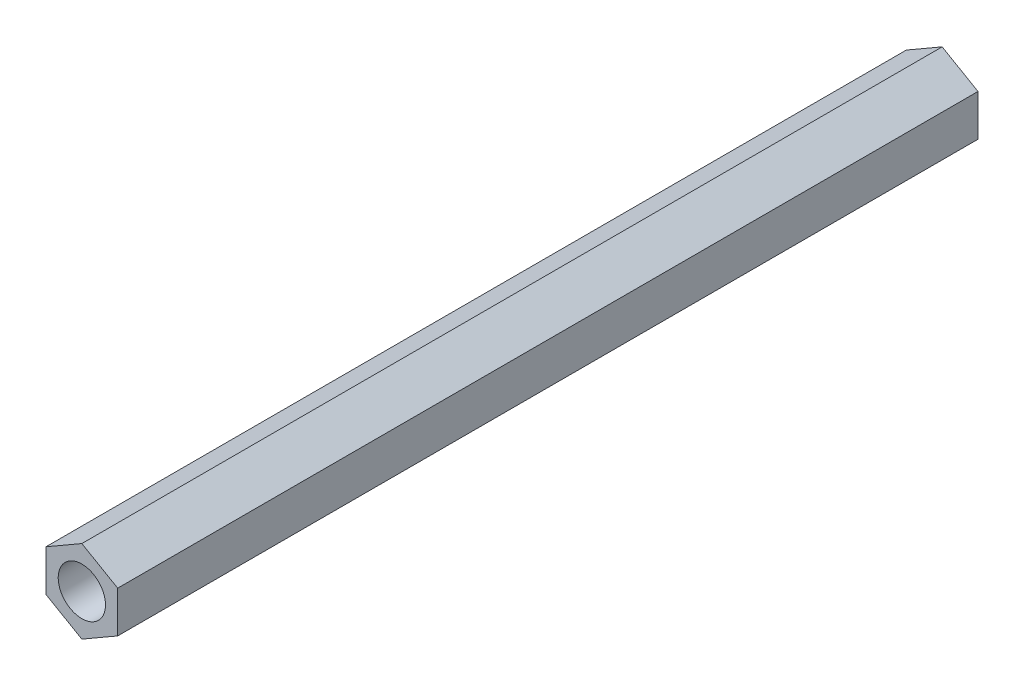
ISO-10303-21;
HEADER;
FILE_DESCRIPTION(('STEP AP214'),'2;1');
FILE_NAME('part.step','',(''),(''),'','','');
FILE_SCHEMA(('AUTOMOTIVE_DESIGN { 1 0 10303 214 1 1 1 1 }'));
ENDSEC;
DATA;
#1=APPLICATION_CONTEXT('core data for automotive mechanical design processes');
#2=APPLICATION_PROTOCOL_DEFINITION('international standard','automotive_design',2000,#1);
#3=PRODUCT_CONTEXT('',#1,'mechanical');
#4=PRODUCT('Part','Part','',(#3));
#5=PRODUCT_RELATED_PRODUCT_CATEGORY('part','',(#4));
#6=PRODUCT_DEFINITION_FORMATION('','',#4);
#7=PRODUCT_DEFINITION_CONTEXT('part definition',#1,'design');
#8=PRODUCT_DEFINITION('design','',#6,#7);
#9=PRODUCT_DEFINITION_SHAPE('','',#8);
#10=(LENGTH_UNIT() NAMED_UNIT(*) SI_UNIT(.MILLI.,.METRE.));
#11=(NAMED_UNIT(*) PLANE_ANGLE_UNIT() SI_UNIT($,.RADIAN.));
#12=(NAMED_UNIT(*) SI_UNIT($,.STERADIAN.) SOLID_ANGLE_UNIT());
#13=UNCERTAINTY_MEASURE_WITH_UNIT(LENGTH_MEASURE(1.E-05),#10,'distance_accuracy_value','');
#14=(GEOMETRIC_REPRESENTATION_CONTEXT(3) GLOBAL_UNCERTAINTY_ASSIGNED_CONTEXT((#13)) GLOBAL_UNIT_ASSIGNED_CONTEXT((#10,
#11,#12)) REPRESENTATION_CONTEXT('',''));
#15=CARTESIAN_POINT('',(0.,0.,0.));
#16=DIRECTION('',(0.,0.,1.));
#17=DIRECTION('',(1.,0.,0.));
#18=AXIS2_PLACEMENT_3D('',#15,#16,#17);
#19=CARTESIAN_POINT('',(3.175,1.83308710467706,76.2));
#20=DIRECTION('',(-0.5,-0.866025403784439,0.));
#21=DIRECTION('',(0.866025403784439,-0.5,0.));
#22=AXIS2_PLACEMENT_3D('',#19,#20,#21);
#23=PLANE('',#22);
#24=DIRECTION('',(0.,0.,1.));
#25=VECTOR('',#24,1.);
#26=CARTESIAN_POINT('',(0.,3.66617420935412,76.2));
#27=LINE('',#26,#25);
#28=CARTESIAN_POINT('',(0.,3.66617420935412,0.));
#29=VERTEX_POINT('',#28);
#30=CARTESIAN_POINT('',(0.,3.66617420935412,76.2));
#31=VERTEX_POINT('',#30);
#32=EDGE_CURVE('E67',#29,#31,#27,.T.);
#33=ORIENTED_EDGE('',*,*,#32,.T.);
#34=DIRECTION('',(-0.866025403784439,0.5,0.));
#35=VECTOR('',#34,1.);
#36=CARTESIAN_POINT('',(3.175,1.83308710467706,76.2));
#37=LINE('',#36,#35);
#38=CARTESIAN_POINT('',(3.175,1.83308710467706,76.2));
#39=VERTEX_POINT('',#38);
#40=EDGE_CURVE('E107',#39,#31,#37,.T.);
#41=ORIENTED_EDGE('',*,*,#40,.F.);
#42=DIRECTION('',(0.,0.,1.));
#43=VECTOR('',#42,1.);
#44=CARTESIAN_POINT('',(3.175,1.83308710467706,76.2));
#45=LINE('',#44,#43);
#46=CARTESIAN_POINT('',(3.175,1.83308710467706,0.));
#47=VERTEX_POINT('',#46);
#48=EDGE_CURVE('E94',#39,#47,#45,.F.);
#49=ORIENTED_EDGE('',*,*,#48,.T.);
#50=DIRECTION('',(-0.866025403784439,0.5,0.));
#51=VECTOR('',#50,1.);
#52=CARTESIAN_POINT('',(3.175,1.83308710467706,0.));
#53=LINE('',#52,#51);
#54=EDGE_CURVE('E108',#47,#29,#53,.T.);
#55=ORIENTED_EDGE('',*,*,#54,.T.);
#56=EDGE_LOOP('',(#33,#41,#49,#55));
#57=FACE_BOUND('',#56,.T.);
#58=ADVANCED_FACE('F18',(#57),#23,.F.);
#59=CARTESIAN_POINT('',(0.,3.66617420935412,76.2));
#60=DIRECTION('',(0.5,-0.866025403784439,0.));
#61=DIRECTION('',(0.866025403784439,0.5,0.));
#62=AXIS2_PLACEMENT_3D('',#59,#60,#61);
#63=PLANE('',#62);
#64=DIRECTION('',(0.,0.,1.));
#65=VECTOR('',#64,1.);
#66=CARTESIAN_POINT('',(-3.175,1.83308710467706,76.2));
#67=LINE('',#66,#65);
#68=CARTESIAN_POINT('',(-3.175,1.83308710467706,0.));
#69=VERTEX_POINT('',#68);
#70=CARTESIAN_POINT('',(-3.175,1.83308710467706,76.2));
#71=VERTEX_POINT('',#70);
#72=EDGE_CURVE('E74',#69,#71,#67,.T.);
#73=ORIENTED_EDGE('',*,*,#72,.T.);
#74=DIRECTION('',(-0.866025403784439,-0.5,0.));
#75=VECTOR('',#74,1.);
#76=CARTESIAN_POINT('',(0.,3.66617420935412,76.2));
#77=LINE('',#76,#75);
#78=EDGE_CURVE('E109',#31,#71,#77,.T.);
#79=ORIENTED_EDGE('',*,*,#78,.F.);
#80=ORIENTED_EDGE('',*,*,#32,.F.);
#81=DIRECTION('',(-0.866025403784439,-0.5,0.));
#82=VECTOR('',#81,1.);
#83=CARTESIAN_POINT('',(0.,3.66617420935412,0.));
#84=LINE('',#83,#82);
#85=EDGE_CURVE('E87',#29,#69,#84,.T.);
#86=ORIENTED_EDGE('',*,*,#85,.T.);
#87=EDGE_LOOP('',(#73,#79,#80,#86));
#88=FACE_BOUND('',#87,.T.);
#89=ADVANCED_FACE('F93',(#88),#63,.F.);
#90=CARTESIAN_POINT('',(-3.175,1.83308710467706,76.2));
#91=DIRECTION('',(1.,0.,0.));
#92=DIRECTION('',(0.,1.,0.));
#93=AXIS2_PLACEMENT_3D('',#90,#91,#92);
#94=PLANE('',#93);
#95=DIRECTION('',(0.,0.,1.));
#96=VECTOR('',#95,1.);
#97=CARTESIAN_POINT('',(-3.175,-1.83308710467706,76.2));
#98=LINE('',#97,#96);
#99=CARTESIAN_POINT('',(-3.175,-1.83308710467706,0.));
#100=VERTEX_POINT('',#99);
#101=CARTESIAN_POINT('',(-3.175,-1.83308710467706,76.2));
#102=VERTEX_POINT('',#101);
#103=EDGE_CURVE('E80',#100,#102,#98,.T.);
#104=ORIENTED_EDGE('',*,*,#103,.T.);
#105=DIRECTION('',(0.,1.,0.));
#106=VECTOR('',#105,1.);
#107=CARTESIAN_POINT('',(-3.175,3.66617420935412,76.2));
#108=LINE('',#107,#106);
#109=EDGE_CURVE('E79',#71,#102,#108,.F.);
#110=ORIENTED_EDGE('',*,*,#109,.F.);
#111=ORIENTED_EDGE('',*,*,#72,.F.);
#112=DIRECTION('',(0.,1.,0.));
#113=VECTOR('',#112,1.);
#114=CARTESIAN_POINT('',(-3.175,3.66617420935412,0.));
#115=LINE('',#114,#113);
#116=EDGE_CURVE('E78',#69,#100,#115,.F.);
#117=ORIENTED_EDGE('',*,*,#116,.T.);
#118=EDGE_LOOP('',(#104,#110,#111,#117));
#119=FACE_BOUND('',#118,.T.);
#120=ADVANCED_FACE('F77',(#119),#94,.F.);
#121=CARTESIAN_POINT('',(-3.175,-1.83308710467706,76.2));
#122=DIRECTION('',(0.5,0.866025403784439,0.));
#123=DIRECTION('',(-0.866025403784439,0.5,0.));
#124=AXIS2_PLACEMENT_3D('',#121,#122,#123);
#125=PLANE('',#124);
#126=DIRECTION('',(0.,0.,1.));
#127=VECTOR('',#126,1.);
#128=CARTESIAN_POINT('',(0.,-3.66617420935412,76.2));
#129=LINE('',#128,#127);
#130=CARTESIAN_POINT('',(0.,-3.66617420935412,0.));
#131=VERTEX_POINT('',#130);
#132=CARTESIAN_POINT('',(0.,-3.66617420935412,76.2));
#133=VERTEX_POINT('',#132);
#134=EDGE_CURVE('E101',#131,#133,#129,.T.);
#135=ORIENTED_EDGE('',*,*,#134,.T.);
#136=DIRECTION('',(0.866025403784438,-0.5,0.));
#137=VECTOR('',#136,1.);
#138=CARTESIAN_POINT('',(-3.175,-1.83308710467706,76.2));
#139=LINE('',#138,#137);
#140=EDGE_CURVE('E111',#102,#133,#139,.T.);
#141=ORIENTED_EDGE('',*,*,#140,.F.);
#142=ORIENTED_EDGE('',*,*,#103,.F.);
#143=DIRECTION('',(0.866025403784438,-0.5,0.));
#144=VECTOR('',#143,1.);
#145=CARTESIAN_POINT('',(-3.175,-1.83308710467706,0.));
#146=LINE('',#145,#144);
#147=EDGE_CURVE('E91',#100,#131,#146,.T.);
#148=ORIENTED_EDGE('',*,*,#147,.T.);
#149=EDGE_LOOP('',(#135,#141,#142,#148));
#150=FACE_BOUND('',#149,.T.);
#151=ADVANCED_FACE('F123',(#150),#125,.F.);
#152=CARTESIAN_POINT('',(0.,-3.66617420935412,76.2));
#153=DIRECTION('',(-0.5,0.866025403784439,0.));
#154=DIRECTION('',(-0.866025403784439,-0.5,0.));
#155=AXIS2_PLACEMENT_3D('',#152,#153,#154);
#156=PLANE('',#155);
#157=DIRECTION('',(0.,0.,1.));
#158=VECTOR('',#157,1.);
#159=CARTESIAN_POINT('',(3.175,-1.83308710467706,76.2));
#160=LINE('',#159,#158);
#161=CARTESIAN_POINT('',(3.175,-1.83308710467706,0.));
#162=VERTEX_POINT('',#161);
#163=CARTESIAN_POINT('',(3.175,-1.83308710467706,76.2));
#164=VERTEX_POINT('',#163);
#165=EDGE_CURVE('E96',#162,#164,#160,.T.);
#166=ORIENTED_EDGE('',*,*,#165,.T.);
#167=DIRECTION('',(0.866025403784439,0.5,0.));
#168=VECTOR('',#167,1.);
#169=CARTESIAN_POINT('',(0.,-3.66617420935412,76.2));
#170=LINE('',#169,#168);
#171=EDGE_CURVE('E34',#133,#164,#170,.T.);
#172=ORIENTED_EDGE('',*,*,#171,.F.);
#173=ORIENTED_EDGE('',*,*,#134,.F.);
#174=DIRECTION('',(0.866025403784439,0.5,0.));
#175=VECTOR('',#174,1.);
#176=CARTESIAN_POINT('',(0.,-3.66617420935412,0.));
#177=LINE('',#176,#175);
#178=EDGE_CURVE('E120',#131,#162,#177,.T.);
#179=ORIENTED_EDGE('',*,*,#178,.T.);
#180=EDGE_LOOP('',(#166,#172,#173,#179));
#181=FACE_BOUND('',#180,.T.);
#182=ADVANCED_FACE('F151',(#181),#156,.F.);
#183=CARTESIAN_POINT('',(3.175,-1.83308710467706,76.2));
#184=DIRECTION('',(-1.,0.,0.));
#185=DIRECTION('',(0.,-1.,0.));
#186=AXIS2_PLACEMENT_3D('',#183,#184,#185);
#187=PLANE('',#186);
#188=ORIENTED_EDGE('',*,*,#48,.F.);
#189=DIRECTION('',(0.,1.,0.));
#190=VECTOR('',#189,1.);
#191=CARTESIAN_POINT('',(3.175,3.66617420935412,76.2));
#192=LINE('',#191,#190);
#193=EDGE_CURVE('E125',#164,#39,#192,.T.);
#194=ORIENTED_EDGE('',*,*,#193,.F.);
#195=ORIENTED_EDGE('',*,*,#165,.F.);
#196=DIRECTION('',(0.,1.,0.));
#197=VECTOR('',#196,1.);
#198=CARTESIAN_POINT('',(3.175,3.66617420935412,0.));
#199=LINE('',#198,#197);
#200=EDGE_CURVE('E117',#162,#47,#199,.T.);
#201=ORIENTED_EDGE('',*,*,#200,.T.);
#202=EDGE_LOOP('',(#188,#194,#195,#201));
#203=FACE_BOUND('',#202,.T.);
#204=ADVANCED_FACE('F148',(#203),#187,.F.);
#205=CARTESIAN_POINT('',(0.,3.66617420935412,0.));
#206=DIRECTION('',(0.,0.,1.));
#207=DIRECTION('',(1.,0.,0.));
#208=AXIS2_PLACEMENT_3D('',#205,#206,#207);
#209=PLANE('',#208);
#210=CARTESIAN_POINT('',(0.,0.,0.));
#211=DIRECTION('',(0.,0.,-1.));
#212=DIRECTION('',(-1.,0.,0.));
#213=AXIS2_PLACEMENT_3D('',#210,#211,#212);
#214=CIRCLE('',#213,2.0955);
#215=CARTESIAN_POINT('',(-2.0955,0.,0.));
#216=VERTEX_POINT('',#215);
#217=EDGE_CURVE('E21',#216,#216,#214,.F.);
#218=ORIENTED_EDGE('',*,*,#217,.T.);
#219=EDGE_LOOP('',(#218));
#220=FACE_BOUND('',#219,.T.);
#221=ORIENTED_EDGE('',*,*,#200,.F.);
#222=ORIENTED_EDGE('',*,*,#178,.F.);
#223=ORIENTED_EDGE('',*,*,#147,.F.);
#224=ORIENTED_EDGE('',*,*,#116,.F.);
#225=ORIENTED_EDGE('',*,*,#85,.F.);
#226=ORIENTED_EDGE('',*,*,#54,.F.);
#227=EDGE_LOOP('',(#221,#222,#223,#224,#225,#226));
#228=FACE_BOUND('',#227,.T.);
#229=ADVANCED_FACE('F85',(#220,#228),#209,.F.);
#230=CARTESIAN_POINT('',(0.,3.66617420935412,76.2));
#231=DIRECTION('',(0.,0.,1.));
#232=DIRECTION('',(1.,0.,0.));
#233=AXIS2_PLACEMENT_3D('',#230,#231,#232);
#234=PLANE('',#233);
#235=CARTESIAN_POINT('',(0.,0.,76.2));
#236=DIRECTION('',(0.,0.,-1.));
#237=DIRECTION('',(-1.,0.,0.));
#238=AXIS2_PLACEMENT_3D('',#235,#236,#237);
#239=CIRCLE('',#238,2.0955);
#240=CARTESIAN_POINT('',(-2.0955,0.,76.2));
#241=VERTEX_POINT('',#240);
#242=EDGE_CURVE('E11',#241,#241,#239,.T.);
#243=ORIENTED_EDGE('',*,*,#242,.T.);
#244=EDGE_LOOP('',(#243));
#245=FACE_BOUND('',#244,.T.);
#246=ORIENTED_EDGE('',*,*,#171,.T.);
#247=ORIENTED_EDGE('',*,*,#193,.T.);
#248=ORIENTED_EDGE('',*,*,#40,.T.);
#249=ORIENTED_EDGE('',*,*,#78,.T.);
#250=ORIENTED_EDGE('',*,*,#109,.T.);
#251=ORIENTED_EDGE('',*,*,#140,.T.);
#252=EDGE_LOOP('',(#246,#247,#248,#249,#250,#251));
#253=FACE_BOUND('',#252,.T.);
#254=ADVANCED_FACE('F135',(#245,#253),#234,.T.);
#255=CARTESIAN_POINT('',(0.,0.,76.2));
#256=DIRECTION('',(0.,0.,-1.));
#257=DIRECTION('',(-1.,0.,0.));
#258=AXIS2_PLACEMENT_3D('',#255,#256,#257);
#259=CYLINDRICAL_SURFACE('',#258,2.0955);
#260=ORIENTED_EDGE('',*,*,#242,.F.);
#261=EDGE_LOOP('',(#260));
#262=FACE_BOUND('',#261,.T.);
#263=ORIENTED_EDGE('',*,*,#217,.F.);
#264=EDGE_LOOP('',(#263));
#265=FACE_BOUND('',#264,.T.);
#266=ADVANCED_FACE('F133',(#262,#265),#259,.F.);
#267=CLOSED_SHELL('',(#58,#89,#120,#151,#182,#204,#229,#254,#266));
#268=MANIFOLD_SOLID_BREP('B1',#267);
#269=ADVANCED_BREP_SHAPE_REPRESENTATION('',(#18,#268),#14);
#270=SHAPE_DEFINITION_REPRESENTATION(#9,#269);
ENDSEC;
END-ISO-10303-21;
